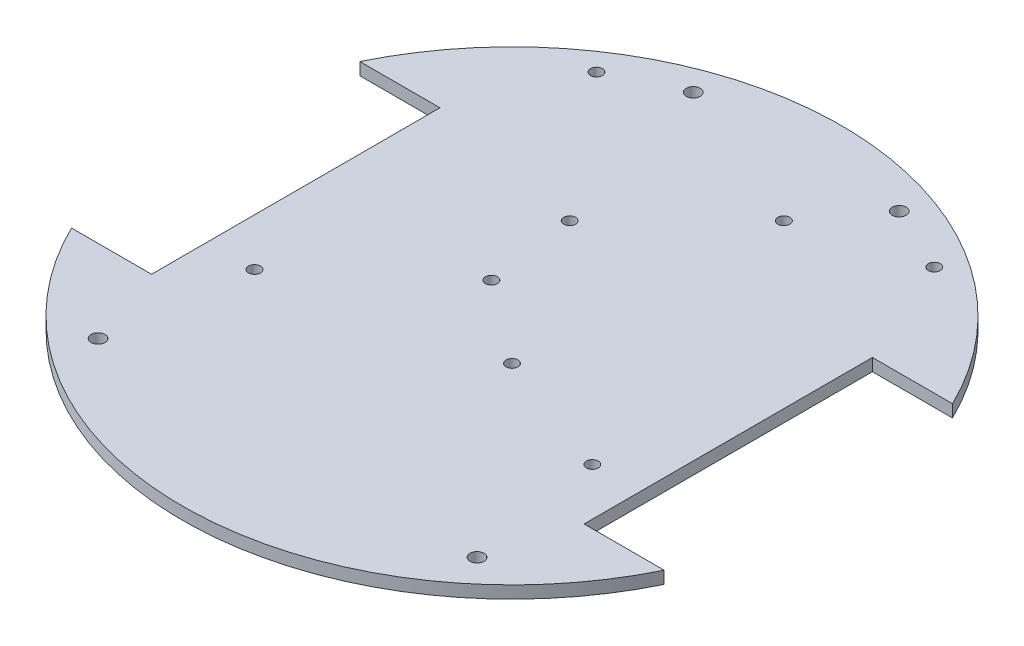
ISO-10303-21;
HEADER;
FILE_DESCRIPTION(('STEP AP214'),'2;1');
FILE_NAME('part.step','',(''),(''),'','','');
FILE_SCHEMA(('AUTOMOTIVE_DESIGN { 1 0 10303 214 1 1 1 1 }'));
ENDSEC;
DATA;
#1=APPLICATION_CONTEXT('core data for automotive mechanical design processes');
#2=APPLICATION_PROTOCOL_DEFINITION('international standard','automotive_design',2000,#1);
#3=PRODUCT_CONTEXT('',#1,'mechanical');
#4=PRODUCT('Part','Part','',(#3));
#5=PRODUCT_RELATED_PRODUCT_CATEGORY('part','',(#4));
#6=PRODUCT_DEFINITION_FORMATION('','',#4);
#7=PRODUCT_DEFINITION_CONTEXT('part definition',#1,'design');
#8=PRODUCT_DEFINITION('design','',#6,#7);
#9=PRODUCT_DEFINITION_SHAPE('','',#8);
#10=(LENGTH_UNIT() NAMED_UNIT(*) SI_UNIT(.MILLI.,.METRE.));
#11=(NAMED_UNIT(*) PLANE_ANGLE_UNIT() SI_UNIT($,.RADIAN.));
#12=(NAMED_UNIT(*) SI_UNIT($,.STERADIAN.) SOLID_ANGLE_UNIT());
#13=UNCERTAINTY_MEASURE_WITH_UNIT(LENGTH_MEASURE(1.E-05),#10,'distance_accuracy_value','');
#14=(GEOMETRIC_REPRESENTATION_CONTEXT(3) GLOBAL_UNCERTAINTY_ASSIGNED_CONTEXT((#13)) GLOBAL_UNIT_ASSIGNED_CONTEXT((#10,
#11,#12)) REPRESENTATION_CONTEXT('',''));
#15=CARTESIAN_POINT('',(0.,0.,0.));
#16=DIRECTION('',(0.,0.,1.));
#17=DIRECTION('',(1.,0.,0.));
#18=AXIS2_PLACEMENT_3D('',#15,#16,#17);
#19=CARTESIAN_POINT('',(0.,3.,0.));
#20=DIRECTION('',(0.,-1.,0.));
#21=DIRECTION('',(0.,0.,-1.));
#22=AXIS2_PLACEMENT_3D('',#19,#20,#21);
#23=CYLINDRICAL_SURFACE('',#22,80.);
#24=CARTESIAN_POINT('',(0.,0.,0.));
#25=DIRECTION('',(0.,1.,0.));
#26=DIRECTION('',(0.,0.,1.));
#27=AXIS2_PLACEMENT_3D('',#24,#25,#26);
#28=CIRCLE('',#27,80.);
#29=CARTESIAN_POINT('',(-71.9374728496908,0.,35.));
#30=VERTEX_POINT('',#29);
#31=CARTESIAN_POINT('',(71.9374728496908,0.,35.));
#32=VERTEX_POINT('',#31);
#33=EDGE_CURVE('E161',#30,#32,#28,.T.);
#34=ORIENTED_EDGE('',*,*,#33,.T.);
#35=DIRECTION('',(0.,-1.,0.));
#36=VECTOR('',#35,1.);
#37=CARTESIAN_POINT('',(71.9374728496908,3.,35.));
#38=LINE('',#37,#36);
#39=CARTESIAN_POINT('',(71.9374728496908,3.,35.));
#40=VERTEX_POINT('',#39);
#41=EDGE_CURVE('E114',#32,#40,#38,.F.);
#42=ORIENTED_EDGE('',*,*,#41,.T.);
#43=CARTESIAN_POINT('',(0.,3.,0.));
#44=DIRECTION('',(0.,1.,0.));
#45=DIRECTION('',(0.,0.,1.));
#46=AXIS2_PLACEMENT_3D('',#43,#44,#45);
#47=CIRCLE('',#46,80.);
#48=CARTESIAN_POINT('',(-71.9374728496908,3.,35.));
#49=VERTEX_POINT('',#48);
#50=EDGE_CURVE('E157',#49,#40,#47,.T.);
#51=ORIENTED_EDGE('',*,*,#50,.F.);
#52=DIRECTION('',(0.,-1.,0.));
#53=VECTOR('',#52,1.);
#54=CARTESIAN_POINT('',(-71.9374728496908,3.,35.));
#55=LINE('',#54,#53);
#56=EDGE_CURVE('E154',#49,#30,#55,.T.);
#57=ORIENTED_EDGE('',*,*,#56,.T.);
#58=EDGE_LOOP('',(#34,#42,#51,#57));
#59=FACE_BOUND('',#58,.T.);
#60=ADVANCED_FACE('F32',(#59),#23,.T.);
#61=CARTESIAN_POINT('',(71.9374728496908,3.,-35.));
#62=VERTEX_POINT('',#61);
#63=CARTESIAN_POINT('',(-71.9374728496908,3.,-35.));
#64=VERTEX_POINT('',#63);
#65=EDGE_CURVE('E160',#62,#64,#47,.T.);
#66=ORIENTED_EDGE('',*,*,#65,.F.);
#67=DIRECTION('',(0.,-1.,0.));
#68=VECTOR('',#67,1.);
#69=CARTESIAN_POINT('',(71.9374728496908,3.,-35.));
#70=LINE('',#69,#68);
#71=CARTESIAN_POINT('',(71.9374728496908,0.,-35.));
#72=VERTEX_POINT('',#71);
#73=EDGE_CURVE('E107',#62,#72,#70,.T.);
#74=ORIENTED_EDGE('',*,*,#73,.T.);
#75=CARTESIAN_POINT('',(-71.9374728496908,0.,-35.));
#76=VERTEX_POINT('',#75);
#77=EDGE_CURVE('E57',#72,#76,#28,.T.);
#78=ORIENTED_EDGE('',*,*,#77,.T.);
#79=DIRECTION('',(0.,-1.,0.));
#80=VECTOR('',#79,1.);
#81=CARTESIAN_POINT('',(-71.9374728496908,3.,-35.));
#82=LINE('',#81,#80);
#83=EDGE_CURVE('E151',#76,#64,#82,.F.);
#84=ORIENTED_EDGE('',*,*,#83,.T.);
#85=EDGE_LOOP('',(#66,#74,#78,#84));
#86=FACE_BOUND('',#85,.T.);
#87=ADVANCED_FACE('F34',(#86),#23,.T.);
#88=CARTESIAN_POINT('',(0.,3.,0.));
#89=DIRECTION('',(0.,1.,0.));
#90=DIRECTION('',(0.,0.,1.));
#91=AXIS2_PLACEMENT_3D('',#88,#89,#90);
#92=PLANE('',#91);
#93=CARTESIAN_POINT('',(-45.4835722084265,3.,55.));
#94=DIRECTION('',(0.,1.,0.));
#95=DIRECTION('',(0.,0.,1.));
#96=AXIS2_PLACEMENT_3D('',#93,#94,#95);
#97=CIRCLE('',#96,1.69999999999999);
#98=CARTESIAN_POINT('',(-45.4835722084265,3.,56.7));
#99=VERTEX_POINT('',#98);
#100=EDGE_CURVE('E203',#99,#99,#97,.T.);
#101=ORIENTED_EDGE('',*,*,#100,.F.);
#102=EDGE_LOOP('',(#101));
#103=FACE_BOUND('',#102,.T.);
#104=CARTESIAN_POINT('',(46.5164277915735,3.,55.));
#105=DIRECTION('',(0.,1.,0.));
#106=DIRECTION('',(0.,0.,1.));
#107=AXIS2_PLACEMENT_3D('',#104,#105,#106);
#108=CIRCLE('',#107,1.69999999999999);
#109=CARTESIAN_POINT('',(46.5164277915735,3.,56.7));
#110=VERTEX_POINT('',#109);
#111=EDGE_CURVE('E193',#110,#110,#108,.T.);
#112=ORIENTED_EDGE('',*,*,#111,.F.);
#113=EDGE_LOOP('',(#112));
#114=FACE_BOUND('',#113,.T.);
#115=CARTESIAN_POINT('',(-25.,3.,-69.));
#116=DIRECTION('',(0.,1.,0.));
#117=DIRECTION('',(0.,0.,1.));
#118=AXIS2_PLACEMENT_3D('',#115,#116,#117);
#119=CIRCLE('',#118,1.7);
#120=CARTESIAN_POINT('',(-25.,3.,-67.3));
#121=VERTEX_POINT('',#120);
#122=EDGE_CURVE('E190',#121,#121,#119,.T.);
#123=ORIENTED_EDGE('',*,*,#122,.F.);
#124=EDGE_LOOP('',(#123));
#125=FACE_BOUND('',#124,.T.);
#126=CARTESIAN_POINT('',(25.,3.,-69.));
#127=DIRECTION('',(0.,1.,0.));
#128=DIRECTION('',(0.,0.,1.));
#129=AXIS2_PLACEMENT_3D('',#126,#127,#128);
#130=CIRCLE('',#129,1.7);
#131=CARTESIAN_POINT('',(25.,3.,-67.3));
#132=VERTEX_POINT('',#131);
#133=EDGE_CURVE('E189',#132,#132,#130,.T.);
#134=ORIENTED_EDGE('',*,*,#133,.F.);
#135=EDGE_LOOP('',(#134));
#136=FACE_BOUND('',#135,.T.);
#137=CARTESIAN_POINT('',(-13.,3.,-27.));
#138=DIRECTION('',(0.,1.,0.));
#139=DIRECTION('',(0.,0.,1.));
#140=AXIS2_PLACEMENT_3D('',#137,#138,#139);
#141=CIRCLE('',#140,1.44999999999999);
#142=CARTESIAN_POINT('',(-13.,3.,-25.55));
#143=VERTEX_POINT('',#142);
#144=EDGE_CURVE('E186',#143,#143,#141,.T.);
#145=ORIENTED_EDGE('',*,*,#144,.F.);
#146=EDGE_LOOP('',(#145));
#147=FACE_BOUND('',#146,.T.);
#148=CARTESIAN_POINT('',(13.,3.,-53.));
#149=DIRECTION('',(0.,1.,0.));
#150=DIRECTION('',(0.,0.,1.));
#151=AXIS2_PLACEMENT_3D('',#148,#149,#150);
#152=CIRCLE('',#151,1.44999999999999);
#153=CARTESIAN_POINT('',(13.,3.,-51.55));
#154=VERTEX_POINT('',#153);
#155=EDGE_CURVE('E182',#154,#154,#152,.T.);
#156=ORIENTED_EDGE('',*,*,#155,.F.);
#157=EDGE_LOOP('',(#156));
#158=FACE_BOUND('',#157,.T.);
#159=CARTESIAN_POINT('',(-10.,3.,-5.));
#160=DIRECTION('',(0.,1.,0.));
#161=DIRECTION('',(0.,0.,1.));
#162=AXIS2_PLACEMENT_3D('',#159,#160,#161);
#163=CIRCLE('',#162,1.44999999999999);
#164=CARTESIAN_POINT('',(-10.,3.,-3.55000000000001));
#165=VERTEX_POINT('',#164);
#166=EDGE_CURVE('E178',#165,#165,#163,.T.);
#167=ORIENTED_EDGE('',*,*,#166,.F.);
#168=EDGE_LOOP('',(#167));
#169=FACE_BOUND('',#168,.T.);
#170=CARTESIAN_POINT('',(9.99999999999999,3.,10.));
#171=DIRECTION('',(0.,1.,0.));
#172=DIRECTION('',(0.,0.,1.));
#173=AXIS2_PLACEMENT_3D('',#170,#171,#172);
#174=CIRCLE('',#173,1.44999999999999);
#175=CARTESIAN_POINT('',(9.99999999999999,3.,11.45));
#176=VERTEX_POINT('',#175);
#177=EDGE_CURVE('E174',#176,#176,#174,.T.);
#178=ORIENTED_EDGE('',*,*,#177,.F.);
#179=EDGE_LOOP('',(#178));
#180=FACE_BOUND('',#179,.T.);
#181=CARTESIAN_POINT('',(-41.,3.,-61.5));
#182=DIRECTION('',(0.,1.,0.));
#183=DIRECTION('',(0.,0.,1.));
#184=AXIS2_PLACEMENT_3D('',#181,#182,#183);
#185=CIRCLE('',#184,1.44999999999999);
#186=CARTESIAN_POINT('',(-41.,3.,-60.05));
#187=VERTEX_POINT('',#186);
#188=EDGE_CURVE('E173',#187,#187,#185,.T.);
#189=ORIENTED_EDGE('',*,*,#188,.F.);
#190=EDGE_LOOP('',(#189));
#191=FACE_BOUND('',#190,.T.);
#192=CARTESIAN_POINT('',(-41.,3.,21.5));
#193=DIRECTION('',(0.,1.,0.));
#194=DIRECTION('',(0.,0.,1.));
#195=AXIS2_PLACEMENT_3D('',#192,#193,#194);
#196=CIRCLE('',#195,1.44999999999999);
#197=CARTESIAN_POINT('',(-41.,3.,22.95));
#198=VERTEX_POINT('',#197);
#199=EDGE_CURVE('E224',#198,#198,#196,.T.);
#200=ORIENTED_EDGE('',*,*,#199,.F.);
#201=EDGE_LOOP('',(#200));
#202=FACE_BOUND('',#201,.T.);
#203=CARTESIAN_POINT('',(41.,3.,21.5));
#204=DIRECTION('',(0.,1.,0.));
#205=DIRECTION('',(0.,0.,1.));
#206=AXIS2_PLACEMENT_3D('',#203,#204,#205);
#207=CIRCLE('',#206,1.44999999999999);
#208=CARTESIAN_POINT('',(41.,3.,22.95));
#209=VERTEX_POINT('',#208);
#210=EDGE_CURVE('E169',#209,#209,#207,.T.);
#211=ORIENTED_EDGE('',*,*,#210,.F.);
#212=EDGE_LOOP('',(#211));
#213=FACE_BOUND('',#212,.T.);
#214=CARTESIAN_POINT('',(41.,3.,-61.5));
#215=DIRECTION('',(0.,1.,0.));
#216=DIRECTION('',(0.,0.,1.));
#217=AXIS2_PLACEMENT_3D('',#214,#215,#216);
#218=CIRCLE('',#217,1.44999999999999);
#219=CARTESIAN_POINT('',(41.,3.,-60.05));
#220=VERTEX_POINT('',#219);
#221=EDGE_CURVE('E168',#220,#220,#218,.T.);
#222=ORIENTED_EDGE('',*,*,#221,.F.);
#223=EDGE_LOOP('',(#222));
#224=FACE_BOUND('',#223,.T.);
#225=DIRECTION('',(1.,0.,0.));
#226=VECTOR('',#225,1.);
#227=CARTESIAN_POINT('',(107.5,3.,35.));
#228=LINE('',#227,#226);
#229=CARTESIAN_POINT('',(52.5,3.,35.));
#230=VERTEX_POINT('',#229);
#231=EDGE_CURVE('E120',#230,#40,#228,.T.);
#232=ORIENTED_EDGE('',*,*,#231,.F.);
#233=DIRECTION('',(0.,0.,1.));
#234=VECTOR('',#233,1.);
#235=CARTESIAN_POINT('',(52.5,3.,35.));
#236=LINE('',#235,#234);
#237=CARTESIAN_POINT('',(52.5,3.,-35.));
#238=VERTEX_POINT('',#237);
#239=EDGE_CURVE('E104',#238,#230,#236,.T.);
#240=ORIENTED_EDGE('',*,*,#239,.F.);
#241=DIRECTION('',(-1.,0.,0.));
#242=VECTOR('',#241,1.);
#243=CARTESIAN_POINT('',(107.5,3.,-35.));
#244=LINE('',#243,#242);
#245=EDGE_CURVE('E127',#62,#238,#244,.T.);
#246=ORIENTED_EDGE('',*,*,#245,.F.);
#247=ORIENTED_EDGE('',*,*,#65,.T.);
#248=DIRECTION('',(-1.,0.,0.));
#249=VECTOR('',#248,1.);
#250=CARTESIAN_POINT('',(-107.5,3.,-35.));
#251=LINE('',#250,#249);
#252=CARTESIAN_POINT('',(-52.5,3.,-35.));
#253=VERTEX_POINT('',#252);
#254=EDGE_CURVE('E144',#253,#64,#251,.T.);
#255=ORIENTED_EDGE('',*,*,#254,.F.);
#256=DIRECTION('',(0.,0.,-1.));
#257=VECTOR('',#256,1.);
#258=CARTESIAN_POINT('',(-52.5,3.,35.));
#259=LINE('',#258,#257);
#260=CARTESIAN_POINT('',(-52.5,3.,35.));
#261=VERTEX_POINT('',#260);
#262=EDGE_CURVE('E133',#261,#253,#259,.T.);
#263=ORIENTED_EDGE('',*,*,#262,.F.);
#264=DIRECTION('',(1.,0.,0.));
#265=VECTOR('',#264,1.);
#266=CARTESIAN_POINT('',(-107.5,3.,35.));
#267=LINE('',#266,#265);
#268=EDGE_CURVE('E138',#49,#261,#267,.T.);
#269=ORIENTED_EDGE('',*,*,#268,.F.);
#270=ORIENTED_EDGE('',*,*,#50,.T.);
#271=EDGE_LOOP('',(#232,#240,#246,#247,#255,#263,#269,#270));
#272=FACE_BOUND('',#271,.T.);
#273=ADVANCED_FACE('F257',(#103,#114,#125,#136,#147,#158,#169,#180,#191,#202,#213,#224,#272),
#92,.T.);
#274=CARTESIAN_POINT('',(0.,0.,0.));
#275=DIRECTION('',(0.,1.,0.));
#276=DIRECTION('',(0.,0.,1.));
#277=AXIS2_PLACEMENT_3D('',#274,#275,#276);
#278=PLANE('',#277);
#279=CARTESIAN_POINT('',(-45.4835722084265,0.,55.));
#280=DIRECTION('',(0.,1.,0.));
#281=DIRECTION('',(0.,0.,1.));
#282=AXIS2_PLACEMENT_3D('',#279,#280,#281);
#283=CIRCLE('',#282,1.69999999999999);
#284=CARTESIAN_POINT('',(-45.4835722084265,0.,56.7));
#285=VERTEX_POINT('',#284);
#286=EDGE_CURVE('E36',#285,#285,#283,.T.);
#287=ORIENTED_EDGE('',*,*,#286,.T.);
#288=EDGE_LOOP('',(#287));
#289=FACE_BOUND('',#288,.T.);
#290=CARTESIAN_POINT('',(46.5164277915735,0.,55.));
#291=DIRECTION('',(0.,1.,0.));
#292=DIRECTION('',(0.,0.,1.));
#293=AXIS2_PLACEMENT_3D('',#290,#291,#292);
#294=CIRCLE('',#293,1.69999999999999);
#295=CARTESIAN_POINT('',(46.5164277915735,0.,56.7));
#296=VERTEX_POINT('',#295);
#297=EDGE_CURVE('E191',#296,#296,#294,.T.);
#298=ORIENTED_EDGE('',*,*,#297,.T.);
#299=EDGE_LOOP('',(#298));
#300=FACE_BOUND('',#299,.T.);
#301=CARTESIAN_POINT('',(-25.,0.,-69.));
#302=DIRECTION('',(0.,1.,0.));
#303=DIRECTION('',(0.,0.,1.));
#304=AXIS2_PLACEMENT_3D('',#301,#302,#303);
#305=CIRCLE('',#304,1.69999999999999);
#306=CARTESIAN_POINT('',(-25.,0.,-67.3));
#307=VERTEX_POINT('',#306);
#308=EDGE_CURVE('E187',#307,#307,#305,.T.);
#309=ORIENTED_EDGE('',*,*,#308,.T.);
#310=EDGE_LOOP('',(#309));
#311=FACE_BOUND('',#310,.T.);
#312=CARTESIAN_POINT('',(25.,0.,-69.));
#313=DIRECTION('',(0.,1.,0.));
#314=DIRECTION('',(0.,0.,1.));
#315=AXIS2_PLACEMENT_3D('',#312,#313,#314);
#316=CIRCLE('',#315,1.69999999999999);
#317=CARTESIAN_POINT('',(25.,0.,-67.3));
#318=VERTEX_POINT('',#317);
#319=EDGE_CURVE('E208',#318,#318,#316,.T.);
#320=ORIENTED_EDGE('',*,*,#319,.T.);
#321=EDGE_LOOP('',(#320));
#322=FACE_BOUND('',#321,.T.);
#323=CARTESIAN_POINT('',(-13.,0.,-27.));
#324=DIRECTION('',(0.,1.,0.));
#325=DIRECTION('',(0.,0.,1.));
#326=AXIS2_PLACEMENT_3D('',#323,#324,#325);
#327=CIRCLE('',#326,1.44999999999999);
#328=CARTESIAN_POINT('',(-13.,0.,-25.55));
#329=VERTEX_POINT('',#328);
#330=EDGE_CURVE('E183',#329,#329,#327,.T.);
#331=ORIENTED_EDGE('',*,*,#330,.T.);
#332=EDGE_LOOP('',(#331));
#333=FACE_BOUND('',#332,.T.);
#334=CARTESIAN_POINT('',(13.,0.,-53.));
#335=DIRECTION('',(0.,1.,0.));
#336=DIRECTION('',(0.,0.,1.));
#337=AXIS2_PLACEMENT_3D('',#334,#335,#336);
#338=CIRCLE('',#337,1.44999999999999);
#339=CARTESIAN_POINT('',(13.,0.,-51.55));
#340=VERTEX_POINT('',#339);
#341=EDGE_CURVE('E179',#340,#340,#338,.T.);
#342=ORIENTED_EDGE('',*,*,#341,.T.);
#343=EDGE_LOOP('',(#342));
#344=FACE_BOUND('',#343,.T.);
#345=CARTESIAN_POINT('',(-10.,0.,-5.));
#346=DIRECTION('',(0.,1.,0.));
#347=DIRECTION('',(0.,0.,1.));
#348=AXIS2_PLACEMENT_3D('',#345,#346,#347);
#349=CIRCLE('',#348,1.44999999999999);
#350=CARTESIAN_POINT('',(-10.,0.,-3.55000000000001));
#351=VERTEX_POINT('',#350);
#352=EDGE_CURVE('E175',#351,#351,#349,.T.);
#353=ORIENTED_EDGE('',*,*,#352,.T.);
#354=EDGE_LOOP('',(#353));
#355=FACE_BOUND('',#354,.T.);
#356=CARTESIAN_POINT('',(9.99999999999999,0.,10.));
#357=DIRECTION('',(0.,1.,0.));
#358=DIRECTION('',(0.,0.,1.));
#359=AXIS2_PLACEMENT_3D('',#356,#357,#358);
#360=CIRCLE('',#359,1.44999999999999);
#361=CARTESIAN_POINT('',(9.99999999999999,0.,11.45));
#362=VERTEX_POINT('',#361);
#363=EDGE_CURVE('E170',#362,#362,#360,.T.);
#364=ORIENTED_EDGE('',*,*,#363,.T.);
#365=EDGE_LOOP('',(#364));
#366=FACE_BOUND('',#365,.T.);
#367=CARTESIAN_POINT('',(-41.,0.,-61.5));
#368=DIRECTION('',(0.,1.,0.));
#369=DIRECTION('',(0.,0.,1.));
#370=AXIS2_PLACEMENT_3D('',#367,#368,#369);
#371=CIRCLE('',#370,1.44999999999999);
#372=CARTESIAN_POINT('',(-41.,0.,-60.05));
#373=VERTEX_POINT('',#372);
#374=EDGE_CURVE('E221',#373,#373,#371,.T.);
#375=ORIENTED_EDGE('',*,*,#374,.T.);
#376=EDGE_LOOP('',(#375));
#377=FACE_BOUND('',#376,.T.);
#378=CARTESIAN_POINT('',(-41.,0.,21.5));
#379=DIRECTION('',(0.,1.,0.));
#380=DIRECTION('',(0.,0.,1.));
#381=AXIS2_PLACEMENT_3D('',#378,#379,#380);
#382=CIRCLE('',#381,1.44999999999999);
#383=CARTESIAN_POINT('',(-41.,0.,22.95));
#384=VERTEX_POINT('',#383);
#385=EDGE_CURVE('E227',#384,#384,#382,.T.);
#386=ORIENTED_EDGE('',*,*,#385,.T.);
#387=EDGE_LOOP('',(#386));
#388=FACE_BOUND('',#387,.T.);
#389=CARTESIAN_POINT('',(41.,0.,21.5));
#390=DIRECTION('',(0.,1.,0.));
#391=DIRECTION('',(0.,0.,1.));
#392=AXIS2_PLACEMENT_3D('',#389,#390,#391);
#393=CIRCLE('',#392,1.44999999999999);
#394=CARTESIAN_POINT('',(41.,0.,22.95));
#395=VERTEX_POINT('',#394);
#396=EDGE_CURVE('E165',#395,#395,#393,.T.);
#397=ORIENTED_EDGE('',*,*,#396,.T.);
#398=EDGE_LOOP('',(#397));
#399=FACE_BOUND('',#398,.T.);
#400=CARTESIAN_POINT('',(41.,0.,-61.5));
#401=DIRECTION('',(0.,1.,0.));
#402=DIRECTION('',(0.,0.,1.));
#403=AXIS2_PLACEMENT_3D('',#400,#401,#402);
#404=CIRCLE('',#403,1.44999999999999);
#405=CARTESIAN_POINT('',(41.,0.,-60.05));
#406=VERTEX_POINT('',#405);
#407=EDGE_CURVE('E124',#406,#406,#404,.T.);
#408=ORIENTED_EDGE('',*,*,#407,.T.);
#409=EDGE_LOOP('',(#408));
#410=FACE_BOUND('',#409,.T.);
#411=DIRECTION('',(0.,0.,1.));
#412=VECTOR('',#411,1.);
#413=CARTESIAN_POINT('',(52.5,0.,35.));
#414=LINE('',#413,#412);
#415=CARTESIAN_POINT('',(52.5,0.,-35.));
#416=VERTEX_POINT('',#415);
#417=CARTESIAN_POINT('',(52.5,0.,35.));
#418=VERTEX_POINT('',#417);
#419=EDGE_CURVE('E49',#416,#418,#414,.T.);
#420=ORIENTED_EDGE('',*,*,#419,.T.);
#421=DIRECTION('',(1.,0.,0.));
#422=VECTOR('',#421,1.);
#423=CARTESIAN_POINT('',(107.5,0.,35.));
#424=LINE('',#423,#422);
#425=EDGE_CURVE('E111',#418,#32,#424,.T.);
#426=ORIENTED_EDGE('',*,*,#425,.T.);
#427=ORIENTED_EDGE('',*,*,#33,.F.);
#428=DIRECTION('',(1.,0.,0.));
#429=VECTOR('',#428,1.);
#430=CARTESIAN_POINT('',(0.,0.,35.));
#431=LINE('',#430,#429);
#432=CARTESIAN_POINT('',(-52.5,0.,35.));
#433=VERTEX_POINT('',#432);
#434=EDGE_CURVE('E41',#30,#433,#431,.T.);
#435=ORIENTED_EDGE('',*,*,#434,.T.);
#436=DIRECTION('',(0.,0.,-1.));
#437=VECTOR('',#436,1.);
#438=CARTESIAN_POINT('',(-52.5,0.,35.));
#439=LINE('',#438,#437);
#440=CARTESIAN_POINT('',(-52.5,0.,-35.));
#441=VERTEX_POINT('',#440);
#442=EDGE_CURVE('E134',#433,#441,#439,.T.);
#443=ORIENTED_EDGE('',*,*,#442,.T.);
#444=DIRECTION('',(-1.,0.,0.));
#445=VECTOR('',#444,1.);
#446=CARTESIAN_POINT('',(-107.5,0.,-35.));
#447=LINE('',#446,#445);
#448=EDGE_CURVE('E137',#441,#76,#447,.T.);
#449=ORIENTED_EDGE('',*,*,#448,.T.);
#450=ORIENTED_EDGE('',*,*,#77,.F.);
#451=DIRECTION('',(-1.,0.,0.));
#452=VECTOR('',#451,1.);
#453=CARTESIAN_POINT('',(0.,0.,-35.));
#454=LINE('',#453,#452);
#455=EDGE_CURVE('E11',#72,#416,#454,.T.);
#456=ORIENTED_EDGE('',*,*,#455,.T.);
#457=EDGE_LOOP('',(#420,#426,#427,#435,#443,#449,#450,#456));
#458=FACE_BOUND('',#457,.T.);
#459=ADVANCED_FACE('F119',(#289,#300,#311,#322,#333,#344,#355,#366,#377,#388,#399,#410,#458),
#278,.F.);
#460=CARTESIAN_POINT('',(-107.5,0.,35.));
#461=DIRECTION('',(0.,0.,1.));
#462=DIRECTION('',(1.,0.,0.));
#463=AXIS2_PLACEMENT_3D('',#460,#461,#462);
#464=PLANE('',#463);
#465=ORIENTED_EDGE('',*,*,#268,.T.);
#466=DIRECTION('',(0.,1.,0.));
#467=VECTOR('',#466,1.);
#468=CARTESIAN_POINT('',(-52.5,0.,35.));
#469=LINE('',#468,#467);
#470=EDGE_CURVE('E148',#433,#261,#469,.T.);
#471=ORIENTED_EDGE('',*,*,#470,.F.);
#472=ORIENTED_EDGE('',*,*,#434,.F.);
#473=ORIENTED_EDGE('',*,*,#56,.F.);
#474=EDGE_LOOP('',(#465,#471,#472,#473));
#475=FACE_BOUND('',#474,.T.);
#476=ADVANCED_FACE('F261',(#475),#464,.F.);
#477=CARTESIAN_POINT('',(-107.5,0.,-35.));
#478=DIRECTION('',(0.,0.,-1.));
#479=DIRECTION('',(-1.,0.,0.));
#480=AXIS2_PLACEMENT_3D('',#477,#478,#479);
#481=PLANE('',#480);
#482=ORIENTED_EDGE('',*,*,#448,.F.);
#483=DIRECTION('',(0.,1.,0.));
#484=VECTOR('',#483,1.);
#485=CARTESIAN_POINT('',(-52.5,0.,-35.));
#486=LINE('',#485,#484);
#487=EDGE_CURVE('E141',#441,#253,#486,.T.);
#488=ORIENTED_EDGE('',*,*,#487,.T.);
#489=ORIENTED_EDGE('',*,*,#254,.T.);
#490=ORIENTED_EDGE('',*,*,#83,.F.);
#491=EDGE_LOOP('',(#482,#488,#489,#490));
#492=FACE_BOUND('',#491,.T.);
#493=ADVANCED_FACE('F269',(#492),#481,.F.);
#494=CARTESIAN_POINT('',(-52.5,0.,35.));
#495=DIRECTION('',(1.,0.,0.));
#496=DIRECTION('',(0.,0.,-1.));
#497=AXIS2_PLACEMENT_3D('',#494,#495,#496);
#498=PLANE('',#497);
#499=ORIENTED_EDGE('',*,*,#262,.T.);
#500=ORIENTED_EDGE('',*,*,#487,.F.);
#501=ORIENTED_EDGE('',*,*,#442,.F.);
#502=ORIENTED_EDGE('',*,*,#470,.T.);
#503=EDGE_LOOP('',(#499,#500,#501,#502));
#504=FACE_BOUND('',#503,.T.);
#505=ADVANCED_FACE('F265',(#504),#498,.F.);
#506=CARTESIAN_POINT('',(107.5,0.,35.));
#507=DIRECTION('',(0.,0.,1.));
#508=DIRECTION('',(1.,0.,0.));
#509=AXIS2_PLACEMENT_3D('',#506,#507,#508);
#510=PLANE('',#509);
#511=ORIENTED_EDGE('',*,*,#425,.F.);
#512=DIRECTION('',(0.,1.,0.));
#513=VECTOR('',#512,1.);
#514=CARTESIAN_POINT('',(52.5,0.,35.));
#515=LINE('',#514,#513);
#516=EDGE_CURVE('E100',#418,#230,#515,.T.);
#517=ORIENTED_EDGE('',*,*,#516,.T.);
#518=ORIENTED_EDGE('',*,*,#231,.T.);
#519=ORIENTED_EDGE('',*,*,#41,.F.);
#520=EDGE_LOOP('',(#511,#517,#518,#519));
#521=FACE_BOUND('',#520,.T.);
#522=ADVANCED_FACE('F112',(#521),#510,.F.);
#523=CARTESIAN_POINT('',(107.5,0.,-35.));
#524=DIRECTION('',(0.,0.,-1.));
#525=DIRECTION('',(-1.,0.,0.));
#526=AXIS2_PLACEMENT_3D('',#523,#524,#525);
#527=PLANE('',#526);
#528=ORIENTED_EDGE('',*,*,#245,.T.);
#529=DIRECTION('',(0.,1.,0.));
#530=VECTOR('',#529,1.);
#531=CARTESIAN_POINT('',(52.5,0.,-35.));
#532=LINE('',#531,#530);
#533=EDGE_CURVE('E108',#416,#238,#532,.T.);
#534=ORIENTED_EDGE('',*,*,#533,.F.);
#535=ORIENTED_EDGE('',*,*,#455,.F.);
#536=ORIENTED_EDGE('',*,*,#73,.F.);
#537=EDGE_LOOP('',(#528,#534,#535,#536));
#538=FACE_BOUND('',#537,.T.);
#539=ADVANCED_FACE('F249',(#538),#527,.F.);
#540=CARTESIAN_POINT('',(52.5,0.,35.));
#541=DIRECTION('',(-1.,0.,0.));
#542=DIRECTION('',(0.,0.,1.));
#543=AXIS2_PLACEMENT_3D('',#540,#541,#542);
#544=PLANE('',#543);
#545=ORIENTED_EDGE('',*,*,#239,.T.);
#546=ORIENTED_EDGE('',*,*,#516,.F.);
#547=ORIENTED_EDGE('',*,*,#419,.F.);
#548=ORIENTED_EDGE('',*,*,#533,.T.);
#549=EDGE_LOOP('',(#545,#546,#547,#548));
#550=FACE_BOUND('',#549,.T.);
#551=ADVANCED_FACE('F102',(#550),#544,.F.);
#552=CARTESIAN_POINT('',(41.,3.,-61.5));
#553=DIRECTION('',(0.,1.,0.));
#554=DIRECTION('',(0.,0.,1.));
#555=AXIS2_PLACEMENT_3D('',#552,#553,#554);
#556=CYLINDRICAL_SURFACE('',#555,1.44999999999999);
#557=ORIENTED_EDGE('',*,*,#221,.T.);
#558=EDGE_LOOP('',(#557));
#559=FACE_BOUND('',#558,.T.);
#560=ORIENTED_EDGE('',*,*,#407,.F.);
#561=EDGE_LOOP('',(#560));
#562=FACE_BOUND('',#561,.T.);
#563=ADVANCED_FACE('F238',(#559,#562),#556,.F.);
#564=CARTESIAN_POINT('',(41.,3.,21.5));
#565=DIRECTION('',(0.,1.,0.));
#566=DIRECTION('',(0.,0.,1.));
#567=AXIS2_PLACEMENT_3D('',#564,#565,#566);
#568=CYLINDRICAL_SURFACE('',#567,1.44999999999999);
#569=ORIENTED_EDGE('',*,*,#210,.T.);
#570=EDGE_LOOP('',(#569));
#571=FACE_BOUND('',#570,.T.);
#572=ORIENTED_EDGE('',*,*,#396,.F.);
#573=EDGE_LOOP('',(#572));
#574=FACE_BOUND('',#573,.T.);
#575=ADVANCED_FACE('F240',(#571,#574),#568,.F.);
#576=CARTESIAN_POINT('',(-41.,3.,21.5));
#577=DIRECTION('',(0.,1.,0.));
#578=DIRECTION('',(0.,0.,1.));
#579=AXIS2_PLACEMENT_3D('',#576,#577,#578);
#580=CYLINDRICAL_SURFACE('',#579,1.44999999999999);
#581=ORIENTED_EDGE('',*,*,#199,.T.);
#582=EDGE_LOOP('',(#581));
#583=FACE_BOUND('',#582,.T.);
#584=ORIENTED_EDGE('',*,*,#385,.F.);
#585=EDGE_LOOP('',(#584));
#586=FACE_BOUND('',#585,.T.);
#587=ADVANCED_FACE('F246',(#583,#586),#580,.F.);
#588=CARTESIAN_POINT('',(-41.,3.,-61.5));
#589=DIRECTION('',(0.,1.,0.));
#590=DIRECTION('',(0.,0.,1.));
#591=AXIS2_PLACEMENT_3D('',#588,#589,#590);
#592=CYLINDRICAL_SURFACE('',#591,1.44999999999999);
#593=ORIENTED_EDGE('',*,*,#188,.T.);
#594=EDGE_LOOP('',(#593));
#595=FACE_BOUND('',#594,.T.);
#596=ORIENTED_EDGE('',*,*,#374,.F.);
#597=EDGE_LOOP('',(#596));
#598=FACE_BOUND('',#597,.T.);
#599=ADVANCED_FACE('F314',(#595,#598),#592,.F.);
#600=CARTESIAN_POINT('',(9.99999999999999,3.,10.));
#601=DIRECTION('',(0.,1.,0.));
#602=DIRECTION('',(0.,0.,1.));
#603=AXIS2_PLACEMENT_3D('',#600,#601,#602);
#604=CYLINDRICAL_SURFACE('',#603,1.44999999999999);
#605=ORIENTED_EDGE('',*,*,#177,.T.);
#606=EDGE_LOOP('',(#605));
#607=FACE_BOUND('',#606,.T.);
#608=ORIENTED_EDGE('',*,*,#363,.F.);
#609=EDGE_LOOP('',(#608));
#610=FACE_BOUND('',#609,.T.);
#611=ADVANCED_FACE('F320',(#607,#610),#604,.F.);
#612=CARTESIAN_POINT('',(-10.,3.,-5.));
#613=DIRECTION('',(0.,1.,0.));
#614=DIRECTION('',(0.,0.,1.));
#615=AXIS2_PLACEMENT_3D('',#612,#613,#614);
#616=CYLINDRICAL_SURFACE('',#615,1.44999999999999);
#617=ORIENTED_EDGE('',*,*,#166,.T.);
#618=EDGE_LOOP('',(#617));
#619=FACE_BOUND('',#618,.T.);
#620=ORIENTED_EDGE('',*,*,#352,.F.);
#621=EDGE_LOOP('',(#620));
#622=FACE_BOUND('',#621,.T.);
#623=ADVANCED_FACE('F326',(#619,#622),#616,.F.);
#624=CARTESIAN_POINT('',(13.,3.,-53.));
#625=DIRECTION('',(0.,1.,0.));
#626=DIRECTION('',(0.,0.,1.));
#627=AXIS2_PLACEMENT_3D('',#624,#625,#626);
#628=CYLINDRICAL_SURFACE('',#627,1.44999999999999);
#629=ORIENTED_EDGE('',*,*,#155,.T.);
#630=EDGE_LOOP('',(#629));
#631=FACE_BOUND('',#630,.T.);
#632=ORIENTED_EDGE('',*,*,#341,.F.);
#633=EDGE_LOOP('',(#632));
#634=FACE_BOUND('',#633,.T.);
#635=ADVANCED_FACE('F330',(#631,#634),#628,.F.);
#636=CARTESIAN_POINT('',(-13.,3.,-27.));
#637=DIRECTION('',(0.,1.,0.));
#638=DIRECTION('',(0.,0.,1.));
#639=AXIS2_PLACEMENT_3D('',#636,#637,#638);
#640=CYLINDRICAL_SURFACE('',#639,1.44999999999999);
#641=ORIENTED_EDGE('',*,*,#144,.T.);
#642=EDGE_LOOP('',(#641));
#643=FACE_BOUND('',#642,.T.);
#644=ORIENTED_EDGE('',*,*,#330,.F.);
#645=EDGE_LOOP('',(#644));
#646=FACE_BOUND('',#645,.T.);
#647=ADVANCED_FACE('F334',(#643,#646),#640,.F.);
#648=CARTESIAN_POINT('',(25.,3.,-69.));
#649=DIRECTION('',(0.,1.,0.));
#650=DIRECTION('',(0.,0.,1.));
#651=AXIS2_PLACEMENT_3D('',#648,#649,#650);
#652=CYLINDRICAL_SURFACE('',#651,1.69999999999999);
#653=ORIENTED_EDGE('',*,*,#133,.T.);
#654=EDGE_LOOP('',(#653));
#655=FACE_BOUND('',#654,.T.);
#656=ORIENTED_EDGE('',*,*,#319,.F.);
#657=EDGE_LOOP('',(#656));
#658=FACE_BOUND('',#657,.T.);
#659=ADVANCED_FACE('F338',(#655,#658),#652,.F.);
#660=CARTESIAN_POINT('',(-25.,3.,-69.));
#661=DIRECTION('',(0.,1.,0.));
#662=DIRECTION('',(0.,0.,1.));
#663=AXIS2_PLACEMENT_3D('',#660,#661,#662);
#664=CYLINDRICAL_SURFACE('',#663,1.69999999999999);
#665=ORIENTED_EDGE('',*,*,#122,.T.);
#666=EDGE_LOOP('',(#665));
#667=FACE_BOUND('',#666,.T.);
#668=ORIENTED_EDGE('',*,*,#308,.F.);
#669=EDGE_LOOP('',(#668));
#670=FACE_BOUND('',#669,.T.);
#671=ADVANCED_FACE('F342',(#667,#670),#664,.F.);
#672=CARTESIAN_POINT('',(46.5164277915735,3.,55.));
#673=DIRECTION('',(0.,1.,0.));
#674=DIRECTION('',(0.,0.,1.));
#675=AXIS2_PLACEMENT_3D('',#672,#673,#674);
#676=CYLINDRICAL_SURFACE('',#675,1.69999999999999);
#677=ORIENTED_EDGE('',*,*,#111,.T.);
#678=EDGE_LOOP('',(#677));
#679=FACE_BOUND('',#678,.T.);
#680=ORIENTED_EDGE('',*,*,#297,.F.);
#681=EDGE_LOOP('',(#680));
#682=FACE_BOUND('',#681,.T.);
#683=ADVANCED_FACE('F346',(#679,#682),#676,.F.);
#684=CARTESIAN_POINT('',(-45.4835722084265,3.,55.));
#685=DIRECTION('',(0.,1.,0.));
#686=DIRECTION('',(0.,0.,1.));
#687=AXIS2_PLACEMENT_3D('',#684,#685,#686);
#688=CYLINDRICAL_SURFACE('',#687,1.69999999999999);
#689=ORIENTED_EDGE('',*,*,#100,.T.);
#690=EDGE_LOOP('',(#689));
#691=FACE_BOUND('',#690,.T.);
#692=ORIENTED_EDGE('',*,*,#286,.F.);
#693=EDGE_LOOP('',(#692));
#694=FACE_BOUND('',#693,.T.);
#695=ADVANCED_FACE('F350',(#691,#694),#688,.F.);
#696=CLOSED_SHELL('',(#60,#87,#273,#459,#476,#493,#505,#522,#539,#551,#563,#575,#587,#599,#611,
#623,#635,#647,#659,#671,#683,#695));
#697=MANIFOLD_SOLID_BREP('B2',#696);
#698=ADVANCED_BREP_SHAPE_REPRESENTATION('',(#18,#697),#14);
#699=SHAPE_DEFINITION_REPRESENTATION(#9,#698);
ENDSEC;
END-ISO-10303-21;
